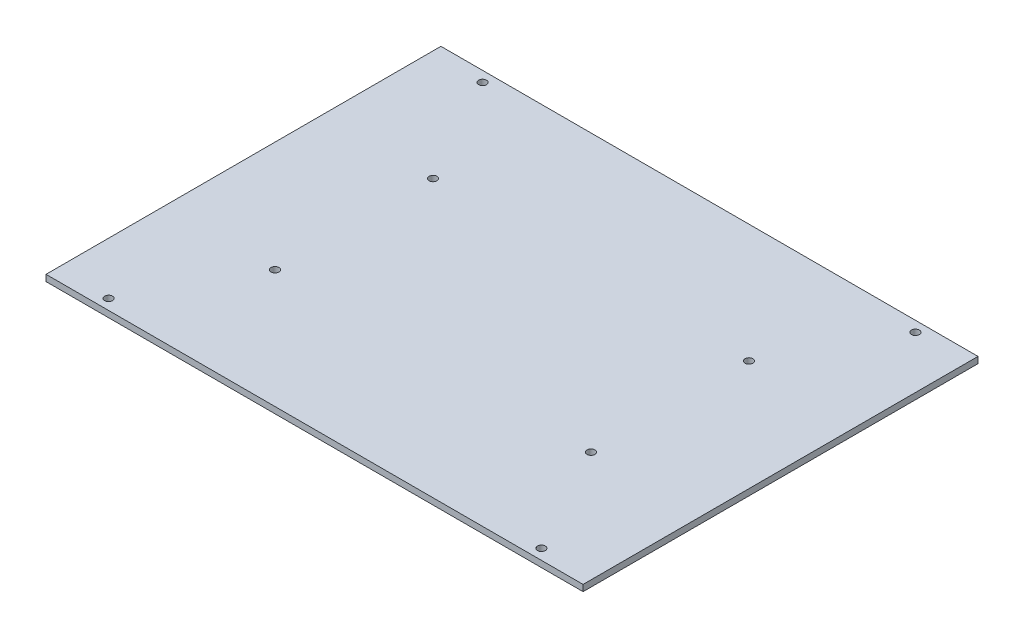
ISO-10303-21;
HEADER;
FILE_DESCRIPTION(('STEP AP214'),'2;1');
FILE_NAME('part.step','',(''),(''),'','','');
FILE_SCHEMA(('AUTOMOTIVE_DESIGN { 1 0 10303 214 1 1 1 1 }'));
ENDSEC;
DATA;
#1=APPLICATION_CONTEXT('core data for automotive mechanical design processes');
#2=APPLICATION_PROTOCOL_DEFINITION('international standard','automotive_design',2000,#1);
#3=PRODUCT_CONTEXT('',#1,'mechanical');
#4=PRODUCT('Part','Part','',(#3));
#5=PRODUCT_RELATED_PRODUCT_CATEGORY('part','',(#4));
#6=PRODUCT_DEFINITION_FORMATION('','',#4);
#7=PRODUCT_DEFINITION_CONTEXT('part definition',#1,'design');
#8=PRODUCT_DEFINITION('design','',#6,#7);
#9=PRODUCT_DEFINITION_SHAPE('','',#8);
#10=(LENGTH_UNIT() NAMED_UNIT(*) SI_UNIT(.MILLI.,.METRE.));
#11=(NAMED_UNIT(*) PLANE_ANGLE_UNIT() SI_UNIT($,.RADIAN.));
#12=(NAMED_UNIT(*) SI_UNIT($,.STERADIAN.) SOLID_ANGLE_UNIT());
#13=UNCERTAINTY_MEASURE_WITH_UNIT(LENGTH_MEASURE(1.E-05),#10,'distance_accuracy_value','');
#14=(GEOMETRIC_REPRESENTATION_CONTEXT(3) GLOBAL_UNCERTAINTY_ASSIGNED_CONTEXT((#13)) GLOBAL_UNIT_ASSIGNED_CONTEXT((#10,
#11,#12)) REPRESENTATION_CONTEXT('',''));
#15=CARTESIAN_POINT('',(0.,0.,0.));
#16=DIRECTION('',(0.,0.,1.));
#17=DIRECTION('',(1.,0.,0.));
#18=AXIS2_PLACEMENT_3D('',#15,#16,#17);
#19=CARTESIAN_POINT('',(-85.,2.,-62.5));
#20=DIRECTION('',(1.,0.,0.));
#21=DIRECTION('',(0.,0.,-1.));
#22=AXIS2_PLACEMENT_3D('',#19,#20,#21);
#23=PLANE('',#22);
#24=DIRECTION('',(0.,0.,1.));
#25=VECTOR('',#24,1.);
#26=CARTESIAN_POINT('',(-85.,0.,-62.5));
#27=LINE('',#26,#25);
#28=CARTESIAN_POINT('',(-85.,0.,-62.5));
#29=VERTEX_POINT('',#28);
#30=CARTESIAN_POINT('',(-85.,0.,62.5));
#31=VERTEX_POINT('',#30);
#32=EDGE_CURVE('E109',#29,#31,#27,.T.);
#33=ORIENTED_EDGE('',*,*,#32,.T.);
#34=DIRECTION('',(0.,-1.,0.));
#35=VECTOR('',#34,1.);
#36=CARTESIAN_POINT('',(-85.,2.,62.5));
#37=LINE('',#36,#35);
#38=CARTESIAN_POINT('',(-85.,2.,62.5));
#39=VERTEX_POINT('',#38);
#40=EDGE_CURVE('E11',#39,#31,#37,.T.);
#41=ORIENTED_EDGE('',*,*,#40,.F.);
#42=DIRECTION('',(0.,0.,1.));
#43=VECTOR('',#42,1.);
#44=CARTESIAN_POINT('',(-85.,2.,-62.5));
#45=LINE('',#44,#43);
#46=CARTESIAN_POINT('',(-85.,2.,-62.5));
#47=VERTEX_POINT('',#46);
#48=EDGE_CURVE('E93',#47,#39,#45,.T.);
#49=ORIENTED_EDGE('',*,*,#48,.F.);
#50=DIRECTION('',(0.,-1.,0.));
#51=VECTOR('',#50,1.);
#52=CARTESIAN_POINT('',(-85.,2.,-62.5));
#53=LINE('',#52,#51);
#54=EDGE_CURVE('E105',#47,#29,#53,.T.);
#55=ORIENTED_EDGE('',*,*,#54,.T.);
#56=EDGE_LOOP('',(#33,#41,#49,#55));
#57=FACE_BOUND('',#56,.T.);
#58=ADVANCED_FACE('F41',(#57),#23,.F.);
#59=CARTESIAN_POINT('',(-85.,2.,62.5));
#60=DIRECTION('',(0.,0.,-1.));
#61=DIRECTION('',(-1.,0.,0.));
#62=AXIS2_PLACEMENT_3D('',#59,#60,#61);
#63=PLANE('',#62);
#64=DIRECTION('',(1.,0.,0.));
#65=VECTOR('',#64,1.);
#66=CARTESIAN_POINT('',(-85.,0.,62.5));
#67=LINE('',#66,#65);
#68=CARTESIAN_POINT('',(85.,0.,62.5));
#69=VERTEX_POINT('',#68);
#70=EDGE_CURVE('E98',#31,#69,#67,.T.);
#71=ORIENTED_EDGE('',*,*,#70,.T.);
#72=DIRECTION('',(0.,-1.,0.));
#73=VECTOR('',#72,1.);
#74=CARTESIAN_POINT('',(85.,2.,62.5));
#75=LINE('',#74,#73);
#76=CARTESIAN_POINT('',(85.,2.,62.5));
#77=VERTEX_POINT('',#76);
#78=EDGE_CURVE('E50',#77,#69,#75,.T.);
#79=ORIENTED_EDGE('',*,*,#78,.F.);
#80=DIRECTION('',(1.,0.,0.));
#81=VECTOR('',#80,1.);
#82=CARTESIAN_POINT('',(-85.,2.,62.5));
#83=LINE('',#82,#81);
#84=EDGE_CURVE('E88',#39,#77,#83,.T.);
#85=ORIENTED_EDGE('',*,*,#84,.F.);
#86=ORIENTED_EDGE('',*,*,#40,.T.);
#87=EDGE_LOOP('',(#71,#79,#85,#86));
#88=FACE_BOUND('',#87,.T.);
#89=ADVANCED_FACE('F97',(#88),#63,.F.);
#90=CARTESIAN_POINT('',(85.,2.,-62.5));
#91=DIRECTION('',(-1.,0.,0.));
#92=DIRECTION('',(0.,0.,1.));
#93=AXIS2_PLACEMENT_3D('',#90,#91,#92);
#94=PLANE('',#93);
#95=DIRECTION('',(0.,0.,-1.));
#96=VECTOR('',#95,1.);
#97=CARTESIAN_POINT('',(85.,0.,-62.5));
#98=LINE('',#97,#96);
#99=CARTESIAN_POINT('',(85.,0.,-62.5));
#100=VERTEX_POINT('',#99);
#101=EDGE_CURVE('E75',#69,#100,#98,.T.);
#102=ORIENTED_EDGE('',*,*,#101,.T.);
#103=DIRECTION('',(0.,-1.,0.));
#104=VECTOR('',#103,1.);
#105=CARTESIAN_POINT('',(85.,2.,-62.5));
#106=LINE('',#105,#104);
#107=CARTESIAN_POINT('',(85.,2.,-62.5));
#108=VERTEX_POINT('',#107);
#109=EDGE_CURVE('E100',#108,#100,#106,.T.);
#110=ORIENTED_EDGE('',*,*,#109,.F.);
#111=DIRECTION('',(0.,0.,-1.));
#112=VECTOR('',#111,1.);
#113=CARTESIAN_POINT('',(85.,2.,-62.5));
#114=LINE('',#113,#112);
#115=EDGE_CURVE('E91',#77,#108,#114,.T.);
#116=ORIENTED_EDGE('',*,*,#115,.F.);
#117=ORIENTED_EDGE('',*,*,#78,.T.);
#118=EDGE_LOOP('',(#102,#110,#116,#117));
#119=FACE_BOUND('',#118,.T.);
#120=ADVANCED_FACE('F101',(#119),#94,.F.);
#121=CARTESIAN_POINT('',(-85.,2.,-62.5));
#122=DIRECTION('',(0.,0.,1.));
#123=DIRECTION('',(1.,0.,0.));
#124=AXIS2_PLACEMENT_3D('',#121,#122,#123);
#125=PLANE('',#124);
#126=DIRECTION('',(-1.,0.,0.));
#127=VECTOR('',#126,1.);
#128=CARTESIAN_POINT('',(-85.,0.,-62.5));
#129=LINE('',#128,#127);
#130=EDGE_CURVE('E81',#100,#29,#129,.T.);
#131=ORIENTED_EDGE('',*,*,#130,.T.);
#132=ORIENTED_EDGE('',*,*,#54,.F.);
#133=DIRECTION('',(-1.,0.,0.));
#134=VECTOR('',#133,1.);
#135=CARTESIAN_POINT('',(-85.,2.,-62.5));
#136=LINE('',#135,#134);
#137=EDGE_CURVE('E58',#108,#47,#136,.T.);
#138=ORIENTED_EDGE('',*,*,#137,.F.);
#139=ORIENTED_EDGE('',*,*,#109,.T.);
#140=EDGE_LOOP('',(#131,#132,#138,#139));
#141=FACE_BOUND('',#140,.T.);
#142=ADVANCED_FACE('F123',(#141),#125,.F.);
#143=CARTESIAN_POINT('',(0.,2.,0.));
#144=DIRECTION('',(0.,1.,0.));
#145=DIRECTION('',(0.,0.,1.));
#146=AXIS2_PLACEMENT_3D('',#143,#144,#145);
#147=PLANE('',#146);
#148=CARTESIAN_POINT('',(-50.,2.,-25.));
#149=DIRECTION('',(0.,1.,0.));
#150=DIRECTION('',(0.,0.,1.));
#151=AXIS2_PLACEMENT_3D('',#148,#149,#150);
#152=CIRCLE('',#151,1.24999999999999);
#153=CARTESIAN_POINT('',(-50.,2.,-23.75));
#154=VERTEX_POINT('',#153);
#155=EDGE_CURVE('E189',#154,#154,#152,.T.);
#156=ORIENTED_EDGE('',*,*,#155,.F.);
#157=EDGE_LOOP('',(#156));
#158=FACE_BOUND('',#157,.T.);
#159=CARTESIAN_POINT('',(50.,2.,-25.));
#160=DIRECTION('',(0.,1.,0.));
#161=DIRECTION('',(0.,0.,1.));
#162=AXIS2_PLACEMENT_3D('',#159,#160,#161);
#163=CIRCLE('',#162,1.24999999999999);
#164=CARTESIAN_POINT('',(50.,2.,-23.75));
#165=VERTEX_POINT('',#164);
#166=EDGE_CURVE('E181',#165,#165,#163,.T.);
#167=ORIENTED_EDGE('',*,*,#166,.F.);
#168=EDGE_LOOP('',(#167));
#169=FACE_BOUND('',#168,.T.);
#170=CARTESIAN_POINT('',(50.,2.,25.));
#171=DIRECTION('',(0.,1.,0.));
#172=DIRECTION('',(0.,0.,1.));
#173=AXIS2_PLACEMENT_3D('',#170,#171,#172);
#174=CIRCLE('',#173,1.24999999999999);
#175=CARTESIAN_POINT('',(50.,2.,26.25));
#176=VERTEX_POINT('',#175);
#177=EDGE_CURVE('E173',#176,#176,#174,.T.);
#178=ORIENTED_EDGE('',*,*,#177,.F.);
#179=EDGE_LOOP('',(#178));
#180=FACE_BOUND('',#179,.T.);
#181=CARTESIAN_POINT('',(-50.,2.,25.));
#182=DIRECTION('',(0.,1.,0.));
#183=DIRECTION('',(0.,0.,1.));
#184=AXIS2_PLACEMENT_3D('',#181,#182,#183);
#185=CIRCLE('',#184,1.24999999999999);
#186=CARTESIAN_POINT('',(-50.,2.,26.25));
#187=VERTEX_POINT('',#186);
#188=EDGE_CURVE('E165',#187,#187,#185,.T.);
#189=ORIENTED_EDGE('',*,*,#188,.F.);
#190=EDGE_LOOP('',(#189));
#191=FACE_BOUND('',#190,.T.);
#192=CARTESIAN_POINT('',(68.5,2.,-59.2));
#193=DIRECTION('',(0.,1.,0.));
#194=DIRECTION('',(0.,0.,1.));
#195=AXIS2_PLACEMENT_3D('',#192,#193,#194);
#196=CIRCLE('',#195,1.24999999999999);
#197=CARTESIAN_POINT('',(68.5,2.,-57.95));
#198=VERTEX_POINT('',#197);
#199=EDGE_CURVE('E157',#198,#198,#196,.T.);
#200=ORIENTED_EDGE('',*,*,#199,.F.);
#201=EDGE_LOOP('',(#200));
#202=FACE_BOUND('',#201,.T.);
#203=CARTESIAN_POINT('',(-68.5,2.,59.2));
#204=DIRECTION('',(0.,1.,0.));
#205=DIRECTION('',(0.,0.,1.));
#206=AXIS2_PLACEMENT_3D('',#203,#204,#205);
#207=CIRCLE('',#206,1.24999999999999);
#208=CARTESIAN_POINT('',(-68.5,2.,60.45));
#209=VERTEX_POINT('',#208);
#210=EDGE_CURVE('E149',#209,#209,#207,.T.);
#211=ORIENTED_EDGE('',*,*,#210,.F.);
#212=EDGE_LOOP('',(#211));
#213=FACE_BOUND('',#212,.T.);
#214=CARTESIAN_POINT('',(-68.5,2.,-59.2));
#215=DIRECTION('',(0.,1.,0.));
#216=DIRECTION('',(0.,0.,1.));
#217=AXIS2_PLACEMENT_3D('',#214,#215,#216);
#218=CIRCLE('',#217,1.24999999999999);
#219=CARTESIAN_POINT('',(-68.5,2.,-57.95));
#220=VERTEX_POINT('',#219);
#221=EDGE_CURVE('E141',#220,#220,#218,.T.);
#222=ORIENTED_EDGE('',*,*,#221,.F.);
#223=EDGE_LOOP('',(#222));
#224=FACE_BOUND('',#223,.T.);
#225=CARTESIAN_POINT('',(68.5,2.,59.2));
#226=DIRECTION('',(0.,1.,0.));
#227=DIRECTION('',(0.,0.,1.));
#228=AXIS2_PLACEMENT_3D('',#225,#226,#227);
#229=CIRCLE('',#228,1.24999999999999);
#230=CARTESIAN_POINT('',(68.5,2.,60.45));
#231=VERTEX_POINT('',#230);
#232=EDGE_CURVE('E133',#231,#231,#229,.T.);
#233=ORIENTED_EDGE('',*,*,#232,.F.);
#234=EDGE_LOOP('',(#233));
#235=FACE_BOUND('',#234,.T.);
#236=ORIENTED_EDGE('',*,*,#48,.T.);
#237=ORIENTED_EDGE('',*,*,#84,.T.);
#238=ORIENTED_EDGE('',*,*,#115,.T.);
#239=ORIENTED_EDGE('',*,*,#137,.T.);
#240=EDGE_LOOP('',(#236,#237,#238,#239));
#241=FACE_BOUND('',#240,.T.);
#242=ADVANCED_FACE('F89',(#158,#169,#180,#191,#202,#213,#224,#235,#241),#147,.T.);
#243=CARTESIAN_POINT('',(0.,0.,0.));
#244=DIRECTION('',(0.,1.,0.));
#245=DIRECTION('',(0.,0.,1.));
#246=AXIS2_PLACEMENT_3D('',#243,#244,#245);
#247=PLANE('',#246);
#248=CARTESIAN_POINT('',(-50.,0.,-25.));
#249=DIRECTION('',(0.,1.,0.));
#250=DIRECTION('',(0.,0.,1.));
#251=AXIS2_PLACEMENT_3D('',#248,#249,#250);
#252=CIRCLE('',#251,1.25);
#253=CARTESIAN_POINT('',(-50.,0.,-23.75));
#254=VERTEX_POINT('',#253);
#255=EDGE_CURVE('E185',#254,#254,#252,.T.);
#256=ORIENTED_EDGE('',*,*,#255,.T.);
#257=EDGE_LOOP('',(#256));
#258=FACE_BOUND('',#257,.T.);
#259=CARTESIAN_POINT('',(50.,0.,-25.));
#260=DIRECTION('',(0.,1.,0.));
#261=DIRECTION('',(0.,0.,1.));
#262=AXIS2_PLACEMENT_3D('',#259,#260,#261);
#263=CIRCLE('',#262,1.25);
#264=CARTESIAN_POINT('',(50.,0.,-23.75));
#265=VERTEX_POINT('',#264);
#266=EDGE_CURVE('E177',#265,#265,#263,.T.);
#267=ORIENTED_EDGE('',*,*,#266,.T.);
#268=EDGE_LOOP('',(#267));
#269=FACE_BOUND('',#268,.T.);
#270=CARTESIAN_POINT('',(50.,0.,25.));
#271=DIRECTION('',(0.,1.,0.));
#272=DIRECTION('',(0.,0.,1.));
#273=AXIS2_PLACEMENT_3D('',#270,#271,#272);
#274=CIRCLE('',#273,1.25);
#275=CARTESIAN_POINT('',(50.,0.,26.25));
#276=VERTEX_POINT('',#275);
#277=EDGE_CURVE('E169',#276,#276,#274,.T.);
#278=ORIENTED_EDGE('',*,*,#277,.T.);
#279=EDGE_LOOP('',(#278));
#280=FACE_BOUND('',#279,.T.);
#281=CARTESIAN_POINT('',(-50.,0.,25.));
#282=DIRECTION('',(0.,1.,0.));
#283=DIRECTION('',(0.,0.,1.));
#284=AXIS2_PLACEMENT_3D('',#281,#282,#283);
#285=CIRCLE('',#284,1.25);
#286=CARTESIAN_POINT('',(-50.,0.,26.25));
#287=VERTEX_POINT('',#286);
#288=EDGE_CURVE('E161',#287,#287,#285,.T.);
#289=ORIENTED_EDGE('',*,*,#288,.T.);
#290=EDGE_LOOP('',(#289));
#291=FACE_BOUND('',#290,.T.);
#292=CARTESIAN_POINT('',(68.5,0.,-59.2));
#293=DIRECTION('',(0.,1.,0.));
#294=DIRECTION('',(0.,0.,1.));
#295=AXIS2_PLACEMENT_3D('',#292,#293,#294);
#296=CIRCLE('',#295,1.25);
#297=CARTESIAN_POINT('',(68.5,0.,-57.95));
#298=VERTEX_POINT('',#297);
#299=EDGE_CURVE('E153',#298,#298,#296,.T.);
#300=ORIENTED_EDGE('',*,*,#299,.T.);
#301=EDGE_LOOP('',(#300));
#302=FACE_BOUND('',#301,.T.);
#303=CARTESIAN_POINT('',(-68.5,0.,59.2));
#304=DIRECTION('',(0.,1.,0.));
#305=DIRECTION('',(0.,0.,1.));
#306=AXIS2_PLACEMENT_3D('',#303,#304,#305);
#307=CIRCLE('',#306,1.25);
#308=CARTESIAN_POINT('',(-68.5,0.,60.45));
#309=VERTEX_POINT('',#308);
#310=EDGE_CURVE('E145',#309,#309,#307,.T.);
#311=ORIENTED_EDGE('',*,*,#310,.T.);
#312=EDGE_LOOP('',(#311));
#313=FACE_BOUND('',#312,.T.);
#314=CARTESIAN_POINT('',(-68.5,0.,-59.2));
#315=DIRECTION('',(0.,1.,0.));
#316=DIRECTION('',(0.,0.,1.));
#317=AXIS2_PLACEMENT_3D('',#314,#315,#316);
#318=CIRCLE('',#317,1.25);
#319=CARTESIAN_POINT('',(-68.5,0.,-57.95));
#320=VERTEX_POINT('',#319);
#321=EDGE_CURVE('E137',#320,#320,#318,.T.);
#322=ORIENTED_EDGE('',*,*,#321,.T.);
#323=EDGE_LOOP('',(#322));
#324=FACE_BOUND('',#323,.T.);
#325=CARTESIAN_POINT('',(68.5,0.,59.2));
#326=DIRECTION('',(0.,1.,0.));
#327=DIRECTION('',(0.,0.,1.));
#328=AXIS2_PLACEMENT_3D('',#325,#326,#327);
#329=CIRCLE('',#328,1.25);
#330=CARTESIAN_POINT('',(68.5,0.,60.45));
#331=VERTEX_POINT('',#330);
#332=EDGE_CURVE('E113',#331,#331,#329,.T.);
#333=ORIENTED_EDGE('',*,*,#332,.T.);
#334=EDGE_LOOP('',(#333));
#335=FACE_BOUND('',#334,.T.);
#336=ORIENTED_EDGE('',*,*,#32,.F.);
#337=ORIENTED_EDGE('',*,*,#130,.F.);
#338=ORIENTED_EDGE('',*,*,#101,.F.);
#339=ORIENTED_EDGE('',*,*,#70,.F.);
#340=EDGE_LOOP('',(#336,#337,#338,#339));
#341=FACE_BOUND('',#340,.T.);
#342=ADVANCED_FACE('F126',(#258,#269,#280,#291,#302,#313,#324,#335,#341),#247,.F.);
#343=CARTESIAN_POINT('',(68.5,2.,59.2));
#344=DIRECTION('',(0.,1.,0.));
#345=DIRECTION('',(0.,0.,1.));
#346=AXIS2_PLACEMENT_3D('',#343,#344,#345);
#347=CYLINDRICAL_SURFACE('',#346,1.24999999999999);
#348=ORIENTED_EDGE('',*,*,#332,.F.);
#349=EDGE_LOOP('',(#348));
#350=FACE_BOUND('',#349,.T.);
#351=ORIENTED_EDGE('',*,*,#232,.T.);
#352=EDGE_LOOP('',(#351));
#353=FACE_BOUND('',#352,.T.);
#354=ADVANCED_FACE('F213',(#350,#353),#347,.F.);
#355=CARTESIAN_POINT('',(-68.5,2.,-59.2));
#356=DIRECTION('',(0.,1.,0.));
#357=DIRECTION('',(0.,0.,1.));
#358=AXIS2_PLACEMENT_3D('',#355,#356,#357);
#359=CYLINDRICAL_SURFACE('',#358,1.24999999999999);
#360=ORIENTED_EDGE('',*,*,#321,.F.);
#361=EDGE_LOOP('',(#360));
#362=FACE_BOUND('',#361,.T.);
#363=ORIENTED_EDGE('',*,*,#221,.T.);
#364=EDGE_LOOP('',(#363));
#365=FACE_BOUND('',#364,.T.);
#366=ADVANCED_FACE('F215',(#362,#365),#359,.F.);
#367=CARTESIAN_POINT('',(-68.5,2.,59.2));
#368=DIRECTION('',(0.,1.,0.));
#369=DIRECTION('',(0.,0.,1.));
#370=AXIS2_PLACEMENT_3D('',#367,#368,#369);
#371=CYLINDRICAL_SURFACE('',#370,1.24999999999999);
#372=ORIENTED_EDGE('',*,*,#310,.F.);
#373=EDGE_LOOP('',(#372));
#374=FACE_BOUND('',#373,.T.);
#375=ORIENTED_EDGE('',*,*,#210,.T.);
#376=EDGE_LOOP('',(#375));
#377=FACE_BOUND('',#376,.T.);
#378=ADVANCED_FACE('F222',(#374,#377),#371,.F.);
#379=CARTESIAN_POINT('',(68.5,2.,-59.2));
#380=DIRECTION('',(0.,1.,0.));
#381=DIRECTION('',(0.,0.,1.));
#382=AXIS2_PLACEMENT_3D('',#379,#380,#381);
#383=CYLINDRICAL_SURFACE('',#382,1.24999999999999);
#384=ORIENTED_EDGE('',*,*,#299,.F.);
#385=EDGE_LOOP('',(#384));
#386=FACE_BOUND('',#385,.T.);
#387=ORIENTED_EDGE('',*,*,#199,.T.);
#388=EDGE_LOOP('',(#387));
#389=FACE_BOUND('',#388,.T.);
#390=ADVANCED_FACE('F269',(#386,#389),#383,.F.);
#391=CARTESIAN_POINT('',(-50.,2.,25.));
#392=DIRECTION('',(0.,1.,0.));
#393=DIRECTION('',(0.,0.,1.));
#394=AXIS2_PLACEMENT_3D('',#391,#392,#393);
#395=CYLINDRICAL_SURFACE('',#394,1.24999999999999);
#396=ORIENTED_EDGE('',*,*,#288,.F.);
#397=EDGE_LOOP('',(#396));
#398=FACE_BOUND('',#397,.T.);
#399=ORIENTED_EDGE('',*,*,#188,.T.);
#400=EDGE_LOOP('',(#399));
#401=FACE_BOUND('',#400,.T.);
#402=ADVANCED_FACE('F279',(#398,#401),#395,.F.);
#403=CARTESIAN_POINT('',(50.,2.,25.));
#404=DIRECTION('',(0.,1.,0.));
#405=DIRECTION('',(0.,0.,1.));
#406=AXIS2_PLACEMENT_3D('',#403,#404,#405);
#407=CYLINDRICAL_SURFACE('',#406,1.24999999999999);
#408=ORIENTED_EDGE('',*,*,#277,.F.);
#409=EDGE_LOOP('',(#408));
#410=FACE_BOUND('',#409,.T.);
#411=ORIENTED_EDGE('',*,*,#177,.T.);
#412=EDGE_LOOP('',(#411));
#413=FACE_BOUND('',#412,.T.);
#414=ADVANCED_FACE('F289',(#410,#413),#407,.F.);
#415=CARTESIAN_POINT('',(50.,2.,-25.));
#416=DIRECTION('',(0.,1.,0.));
#417=DIRECTION('',(0.,0.,1.));
#418=AXIS2_PLACEMENT_3D('',#415,#416,#417);
#419=CYLINDRICAL_SURFACE('',#418,1.24999999999999);
#420=ORIENTED_EDGE('',*,*,#266,.F.);
#421=EDGE_LOOP('',(#420));
#422=FACE_BOUND('',#421,.T.);
#423=ORIENTED_EDGE('',*,*,#166,.T.);
#424=EDGE_LOOP('',(#423));
#425=FACE_BOUND('',#424,.T.);
#426=ADVANCED_FACE('F299',(#422,#425),#419,.F.);
#427=CARTESIAN_POINT('',(-50.,2.,-25.));
#428=DIRECTION('',(0.,1.,0.));
#429=DIRECTION('',(0.,0.,1.));
#430=AXIS2_PLACEMENT_3D('',#427,#428,#429);
#431=CYLINDRICAL_SURFACE('',#430,1.24999999999999);
#432=ORIENTED_EDGE('',*,*,#255,.F.);
#433=EDGE_LOOP('',(#432));
#434=FACE_BOUND('',#433,.T.);
#435=ORIENTED_EDGE('',*,*,#155,.T.);
#436=EDGE_LOOP('',(#435));
#437=FACE_BOUND('',#436,.T.);
#438=ADVANCED_FACE('F194',(#434,#437),#431,.F.);
#439=CLOSED_SHELL('',(#58,#89,#120,#142,#242,#342,#354,#366,#378,#390,#402,#414,#426,#438));
#440=MANIFOLD_SOLID_BREP('B2',#439);
#441=ADVANCED_BREP_SHAPE_REPRESENTATION('',(#18,#440),#14);
#442=SHAPE_DEFINITION_REPRESENTATION(#9,#441);
ENDSEC;
END-ISO-10303-21;
